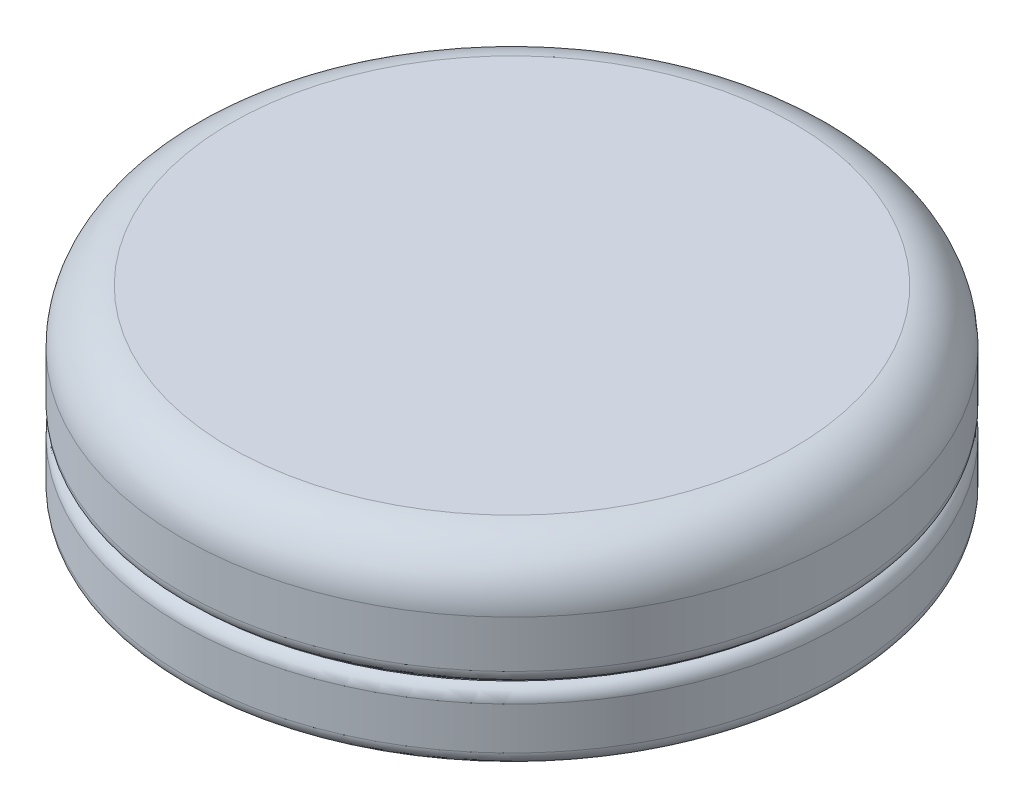
ISO-10303-21;
HEADER;
FILE_DESCRIPTION(('STEP AP214'),'2;1');
FILE_NAME('part.step','',(''),(''),'','','');
FILE_SCHEMA(('AUTOMOTIVE_DESIGN { 1 0 10303 214 1 1 1 1 }'));
ENDSEC;
DATA;
#1=APPLICATION_CONTEXT('core data for automotive mechanical design processes');
#2=APPLICATION_PROTOCOL_DEFINITION('international standard','automotive_design',2000,#1);
#3=PRODUCT_CONTEXT('',#1,'mechanical');
#4=PRODUCT('Part','Part','',(#3));
#5=PRODUCT_RELATED_PRODUCT_CATEGORY('part','',(#4));
#6=PRODUCT_DEFINITION_FORMATION('','',#4);
#7=PRODUCT_DEFINITION_CONTEXT('part definition',#1,'design');
#8=PRODUCT_DEFINITION('design','',#6,#7);
#9=PRODUCT_DEFINITION_SHAPE('','',#8);
#10=(LENGTH_UNIT() NAMED_UNIT(*) SI_UNIT(.MILLI.,.METRE.));
#11=(NAMED_UNIT(*) PLANE_ANGLE_UNIT() SI_UNIT($,.RADIAN.));
#12=(NAMED_UNIT(*) SI_UNIT($,.STERADIAN.) SOLID_ANGLE_UNIT());
#13=UNCERTAINTY_MEASURE_WITH_UNIT(LENGTH_MEASURE(1.E-05),#10,'distance_accuracy_value','');
#14=(GEOMETRIC_REPRESENTATION_CONTEXT(3) GLOBAL_UNCERTAINTY_ASSIGNED_CONTEXT((#13)) GLOBAL_UNIT_ASSIGNED_CONTEXT((#10,
#11,#12)) REPRESENTATION_CONTEXT('',''));
#15=CARTESIAN_POINT('',(0.,0.,0.));
#16=DIRECTION('',(0.,0.,1.));
#17=DIRECTION('',(1.,0.,0.));
#18=AXIS2_PLACEMENT_3D('',#15,#16,#17);
#19=CARTESIAN_POINT('',(0.,0.,0.));
#20=DIRECTION('',(0.,1.,0.));
#21=DIRECTION('',(0.,0.,1.));
#22=AXIS2_PLACEMENT_3D('',#19,#20,#21);
#23=PLANE('',#22);
#24=CARTESIAN_POINT('',(0.,0.,0.));
#25=DIRECTION('',(0.,-1.,0.));
#26=DIRECTION('',(0.,0.,-1.));
#27=AXIS2_PLACEMENT_3D('',#24,#25,#26);
#28=CIRCLE('',#27,17.018);
#29=CARTESIAN_POINT('',(0.,0.,-17.018));
#30=VERTEX_POINT('',#29);
#31=EDGE_CURVE('E10',#30,#30,#28,.T.);
#32=ORIENTED_EDGE('',*,*,#31,.T.);
#33=EDGE_LOOP('',(#32));
#34=FACE_BOUND('',#33,.T.);
#35=ADVANCED_FACE('F31',(#34),#23,.F.);
#36=CARTESIAN_POINT('',(0.,0.761999999999975,0.));
#37=DIRECTION('',(0.,-1.,0.));
#38=DIRECTION('',(0.,0.,-1.));
#39=AXIS2_PLACEMENT_3D('',#36,#37,#38);
#40=TOROIDAL_SURFACE('',#39,17.018,0.762000000000006);
#41=ORIENTED_EDGE('',*,*,#31,.F.);
#42=EDGE_LOOP('',(#41));
#43=FACE_BOUND('',#42,.T.);
#44=CARTESIAN_POINT('',(0.,0.761999999999975,0.));
#45=DIRECTION('',(0.,-1.,0.));
#46=DIRECTION('',(0.,0.,-1.));
#47=AXIS2_PLACEMENT_3D('',#44,#45,#46);
#48=CIRCLE('',#47,17.78);
#49=CARTESIAN_POINT('',(0.,0.761999999999975,-17.78));
#50=VERTEX_POINT('',#49);
#51=EDGE_CURVE('E37',#50,#50,#48,.T.);
#52=ORIENTED_EDGE('',*,*,#51,.T.);
#53=EDGE_LOOP('',(#52));
#54=FACE_BOUND('',#53,.T.);
#55=ADVANCED_FACE('F75',(#43,#54),#40,.T.);
#56=CARTESIAN_POINT('',(0.,0.,0.));
#57=DIRECTION('',(0.,-1.,0.));
#58=DIRECTION('',(0.,0.,-1.));
#59=AXIS2_PLACEMENT_3D('',#56,#57,#58);
#60=CYLINDRICAL_SURFACE('',#59,17.78);
#61=ORIENTED_EDGE('',*,*,#51,.F.);
#62=EDGE_LOOP('',(#61));
#63=FACE_BOUND('',#62,.T.);
#64=CARTESIAN_POINT('',(0.,3.048,0.));
#65=DIRECTION('',(0.,-1.,0.));
#66=DIRECTION('',(0.,0.,-1.));
#67=AXIS2_PLACEMENT_3D('',#64,#65,#66);
#68=CIRCLE('',#67,17.78);
#69=CARTESIAN_POINT('',(0.,3.048,-17.78));
#70=VERTEX_POINT('',#69);
#71=EDGE_CURVE('E41',#70,#70,#68,.T.);
#72=ORIENTED_EDGE('',*,*,#71,.T.);
#73=EDGE_LOOP('',(#72));
#74=FACE_BOUND('',#73,.T.);
#75=ADVANCED_FACE('F79',(#63,#74),#60,.T.);
#76=CARTESIAN_POINT('',(0.,3.048,0.));
#77=DIRECTION('',(0.,-1.,0.));
#78=DIRECTION('',(0.,0.,-1.));
#79=AXIS2_PLACEMENT_3D('',#76,#77,#78);
#80=TOROIDAL_SURFACE('',#79,17.018,0.762000000000006);
#81=ORIENTED_EDGE('',*,*,#71,.F.);
#82=EDGE_LOOP('',(#81));
#83=FACE_BOUND('',#82,.T.);
#84=CARTESIAN_POINT('',(0.,3.76642048968553,0.));
#85=DIRECTION('',(0.,-1.,0.));
#86=DIRECTION('',(0.,0.,-1.));
#87=AXIS2_PLACEMENT_3D('',#84,#85,#86);
#88=CIRCLE('',#87,17.272);
#89=CARTESIAN_POINT('',(0.,3.76642048968553,-17.272));
#90=VERTEX_POINT('',#89);
#91=EDGE_CURVE('E45',#90,#90,#88,.T.);
#92=ORIENTED_EDGE('',*,*,#91,.T.);
#93=EDGE_LOOP('',(#92));
#94=FACE_BOUND('',#93,.T.);
#95=ADVANCED_FACE('F84',(#83,#94),#80,.T.);
#96=CARTESIAN_POINT('',(0.,0.,0.));
#97=DIRECTION('',(0.,-1.,0.));
#98=DIRECTION('',(0.,0.,-1.));
#99=AXIS2_PLACEMENT_3D('',#96,#97,#98);
#100=CYLINDRICAL_SURFACE('',#99,17.272);
#101=ORIENTED_EDGE('',*,*,#91,.F.);
#102=EDGE_LOOP('',(#101));
#103=FACE_BOUND('',#102,.T.);
#104=CARTESIAN_POINT('',(0.,3.85357951031446,0.));
#105=DIRECTION('',(0.,-1.,0.));
#106=DIRECTION('',(0.,0.,-1.));
#107=AXIS2_PLACEMENT_3D('',#104,#105,#106);
#108=CIRCLE('',#107,17.272);
#109=CARTESIAN_POINT('',(0.,3.85357951031446,-17.272));
#110=VERTEX_POINT('',#109);
#111=EDGE_CURVE('E50',#110,#110,#108,.T.);
#112=ORIENTED_EDGE('',*,*,#111,.T.);
#113=EDGE_LOOP('',(#112));
#114=FACE_BOUND('',#113,.T.);
#115=ADVANCED_FACE('F90',(#103,#114),#100,.T.);
#116=CARTESIAN_POINT('',(0.,4.572,0.));
#117=DIRECTION('',(0.,-1.,0.));
#118=DIRECTION('',(0.,0.,-1.));
#119=AXIS2_PLACEMENT_3D('',#116,#117,#118);
#120=TOROIDAL_SURFACE('',#119,17.018,0.762000000000006);
#121=ORIENTED_EDGE('',*,*,#111,.F.);
#122=EDGE_LOOP('',(#121));
#123=FACE_BOUND('',#122,.T.);
#124=CARTESIAN_POINT('',(0.,4.572,0.));
#125=DIRECTION('',(0.,-1.,0.));
#126=DIRECTION('',(0.,0.,-1.));
#127=AXIS2_PLACEMENT_3D('',#124,#125,#126);
#128=CIRCLE('',#127,17.78);
#129=CARTESIAN_POINT('',(0.,4.572,-17.78));
#130=VERTEX_POINT('',#129);
#131=EDGE_CURVE('E53',#130,#130,#128,.T.);
#132=ORIENTED_EDGE('',*,*,#131,.T.);
#133=EDGE_LOOP('',(#132));
#134=FACE_BOUND('',#133,.T.);
#135=ADVANCED_FACE('F94',(#123,#134),#120,.T.);
#136=CARTESIAN_POINT('',(0.,0.,0.));
#137=DIRECTION('',(0.,-1.,0.));
#138=DIRECTION('',(0.,0.,-1.));
#139=AXIS2_PLACEMENT_3D('',#136,#137,#138);
#140=CYLINDRICAL_SURFACE('',#139,17.78);
#141=ORIENTED_EDGE('',*,*,#131,.F.);
#142=EDGE_LOOP('',(#141));
#143=FACE_BOUND('',#142,.T.);
#144=CARTESIAN_POINT('',(0.,7.112,0.));
#145=DIRECTION('',(0.,-1.,0.));
#146=DIRECTION('',(0.,0.,-1.));
#147=AXIS2_PLACEMENT_3D('',#144,#145,#146);
#148=CIRCLE('',#147,17.78);
#149=CARTESIAN_POINT('',(0.,7.112,-17.78));
#150=VERTEX_POINT('',#149);
#151=EDGE_CURVE('E56',#150,#150,#148,.T.);
#152=ORIENTED_EDGE('',*,*,#151,.T.);
#153=EDGE_LOOP('',(#152));
#154=FACE_BOUND('',#153,.T.);
#155=ADVANCED_FACE('F71',(#143,#154),#140,.T.);
#156=CARTESIAN_POINT('',(0.,7.112,0.));
#157=DIRECTION('',(0.,-1.,0.));
#158=DIRECTION('',(0.,0.,-1.));
#159=AXIS2_PLACEMENT_3D('',#156,#157,#158);
#160=TOROIDAL_SURFACE('',#159,14.8377650975335,2.94223490246648);
#161=ORIENTED_EDGE('',*,*,#151,.F.);
#162=EDGE_LOOP('',(#161));
#163=FACE_BOUND('',#162,.T.);
#164=CARTESIAN_POINT('',(0.,10.0349260723206,0.));
#165=DIRECTION('',(0.,-1.,0.));
#166=DIRECTION('',(0.,0.,-1.));
#167=AXIS2_PLACEMENT_3D('',#164,#165,#166);
#168=CIRCLE('',#167,15.1742905750838);
#169=CARTESIAN_POINT('',(0.,10.0349260723206,-15.1742905750838));
#170=VERTEX_POINT('',#169);
#171=EDGE_CURVE('E59',#170,#170,#168,.T.);
#172=ORIENTED_EDGE('',*,*,#171,.T.);
#173=EDGE_LOOP('',(#172));
#174=FACE_BOUND('',#173,.T.);
#175=ADVANCED_FACE('F63',(#163,#174),#160,.T.);
#176=CARTESIAN_POINT('',(-15.1742905750838,10.0349260723206,0.));
#177=DIRECTION('',(0.,-1.,0.));
#178=DIRECTION('',(0.,0.,-1.));
#179=AXIS2_PLACEMENT_3D('',#176,#177,#178);
#180=PLANE('',#179);
#181=ORIENTED_EDGE('',*,*,#171,.F.);
#182=EDGE_LOOP('',(#181));
#183=FACE_BOUND('',#182,.T.);
#184=ADVANCED_FACE('F65',(#183),#180,.F.);
#185=CLOSED_SHELL('',(#35,#55,#75,#95,#115,#135,#155,#175,#184));
#186=MANIFOLD_SOLID_BREP('B2',#185);
#187=ADVANCED_BREP_SHAPE_REPRESENTATION('',(#18,#186),#14);
#188=SHAPE_DEFINITION_REPRESENTATION(#9,#187);
ENDSEC;
END-ISO-10303-21;
